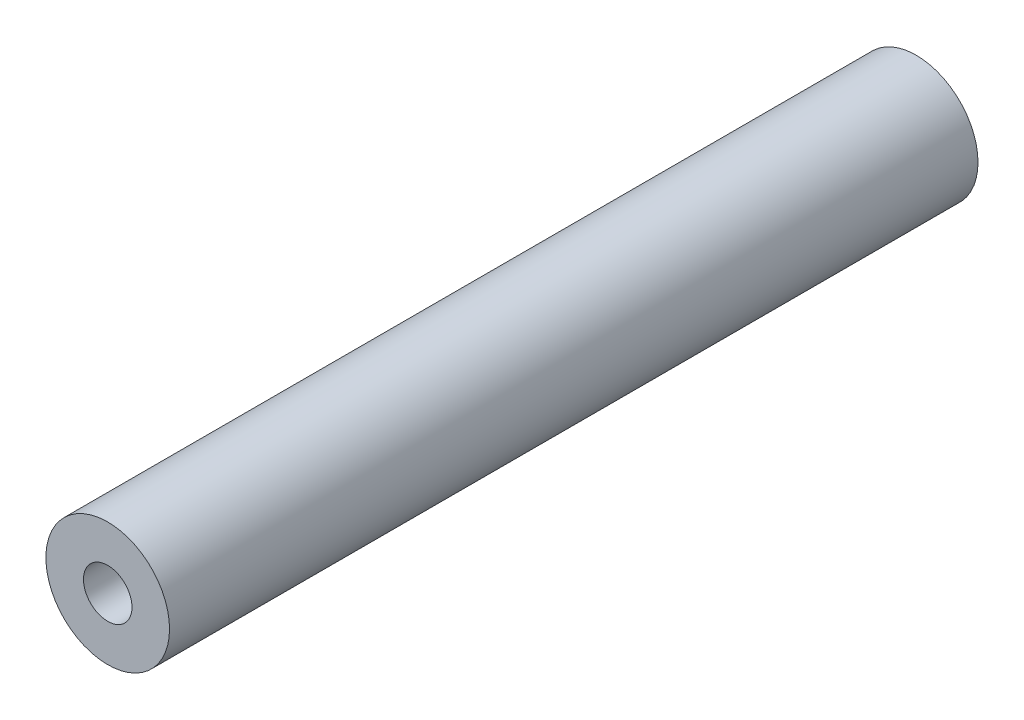
ISO-10303-21;
HEADER;
FILE_DESCRIPTION(('STEP AP214'),'2;1');
FILE_NAME('part.step','',(''),(''),'','','');
FILE_SCHEMA(('AUTOMOTIVE_DESIGN { 1 0 10303 214 1 1 1 1 }'));
ENDSEC;
DATA;
#1=APPLICATION_CONTEXT('core data for automotive mechanical design processes');
#2=APPLICATION_PROTOCOL_DEFINITION('international standard','automotive_design',2000,#1);
#3=PRODUCT_CONTEXT('',#1,'mechanical');
#4=PRODUCT('Part','Part','',(#3));
#5=PRODUCT_RELATED_PRODUCT_CATEGORY('part','',(#4));
#6=PRODUCT_DEFINITION_FORMATION('','',#4);
#7=PRODUCT_DEFINITION_CONTEXT('part definition',#1,'design');
#8=PRODUCT_DEFINITION('design','',#6,#7);
#9=PRODUCT_DEFINITION_SHAPE('','',#8);
#10=(LENGTH_UNIT() NAMED_UNIT(*) SI_UNIT(.MILLI.,.METRE.));
#11=(NAMED_UNIT(*) PLANE_ANGLE_UNIT() SI_UNIT($,.RADIAN.));
#12=(NAMED_UNIT(*) SI_UNIT($,.STERADIAN.) SOLID_ANGLE_UNIT());
#13=UNCERTAINTY_MEASURE_WITH_UNIT(LENGTH_MEASURE(1.E-05),#10,'distance_accuracy_value','');
#14=(GEOMETRIC_REPRESENTATION_CONTEXT(3) GLOBAL_UNCERTAINTY_ASSIGNED_CONTEXT((#13)) GLOBAL_UNIT_ASSIGNED_CONTEXT((#10,
#11,#12)) REPRESENTATION_CONTEXT('',''));
#15=CARTESIAN_POINT('',(0.,0.,0.));
#16=DIRECTION('',(0.,0.,1.));
#17=DIRECTION('',(1.,0.,0.));
#18=AXIS2_PLACEMENT_3D('',#15,#16,#17);
#19=CARTESIAN_POINT('',(0.,0.,85.));
#20=DIRECTION('',(0.,0.,1.));
#21=DIRECTION('',(1.,0.,0.));
#22=AXIS2_PLACEMENT_3D('',#19,#20,#21);
#23=PLANE('',#22);
#24=CARTESIAN_POINT('',(0.,0.,85.));
#25=DIRECTION('',(0.,0.,1.));
#26=DIRECTION('',(1.,0.,0.));
#27=AXIS2_PLACEMENT_3D('',#24,#25,#26);
#28=CIRCLE('',#27,6.5);
#29=CARTESIAN_POINT('',(6.5,0.,85.));
#30=VERTEX_POINT('',#29);
#31=EDGE_CURVE('E10',#30,#30,#28,.T.);
#32=ORIENTED_EDGE('',*,*,#31,.T.);
#33=EDGE_LOOP('',(#32));
#34=FACE_BOUND('',#33,.T.);
#35=CARTESIAN_POINT('',(0.,0.,85.));
#36=DIRECTION('',(0.,0.,1.));
#37=DIRECTION('',(1.,0.,0.));
#38=AXIS2_PLACEMENT_3D('',#35,#36,#37);
#39=CIRCLE('',#38,2.55);
#40=CARTESIAN_POINT('',(2.55,0.,85.));
#41=VERTEX_POINT('',#40);
#42=EDGE_CURVE('E42',#41,#41,#39,.T.);
#43=ORIENTED_EDGE('',*,*,#42,.F.);
#44=EDGE_LOOP('',(#43));
#45=FACE_BOUND('',#44,.T.);
#46=ADVANCED_FACE('F31',(#34,#45),#23,.T.);
#47=CARTESIAN_POINT('',(0.,0.,0.));
#48=DIRECTION('',(0.,0.,1.));
#49=DIRECTION('',(1.,0.,0.));
#50=AXIS2_PLACEMENT_3D('',#47,#48,#49);
#51=PLANE('',#50);
#52=CARTESIAN_POINT('',(0.,0.,0.));
#53=DIRECTION('',(0.,0.,1.));
#54=DIRECTION('',(1.,0.,0.));
#55=AXIS2_PLACEMENT_3D('',#52,#53,#54);
#56=CIRCLE('',#55,6.5);
#57=CARTESIAN_POINT('',(6.5,0.,0.));
#58=VERTEX_POINT('',#57);
#59=EDGE_CURVE('E35',#58,#58,#56,.T.);
#60=ORIENTED_EDGE('',*,*,#59,.F.);
#61=EDGE_LOOP('',(#60));
#62=FACE_BOUND('',#61,.T.);
#63=CARTESIAN_POINT('',(0.,0.,0.));
#64=DIRECTION('',(0.,0.,1.));
#65=DIRECTION('',(1.,0.,0.));
#66=AXIS2_PLACEMENT_3D('',#63,#64,#65);
#67=CIRCLE('',#66,2.55);
#68=CARTESIAN_POINT('',(2.55,0.,0.));
#69=VERTEX_POINT('',#68);
#70=EDGE_CURVE('E44',#69,#69,#67,.T.);
#71=ORIENTED_EDGE('',*,*,#70,.T.);
#72=EDGE_LOOP('',(#71));
#73=FACE_BOUND('',#72,.T.);
#74=ADVANCED_FACE('F54',(#62,#73),#51,.F.);
#75=CARTESIAN_POINT('',(0.,0.,85.));
#76=DIRECTION('',(0.,0.,-1.));
#77=DIRECTION('',(-1.,0.,0.));
#78=AXIS2_PLACEMENT_3D('',#75,#76,#77);
#79=CYLINDRICAL_SURFACE('',#78,6.5);
#80=ORIENTED_EDGE('',*,*,#31,.F.);
#81=EDGE_LOOP('',(#80));
#82=FACE_BOUND('',#81,.T.);
#83=ORIENTED_EDGE('',*,*,#59,.T.);
#84=EDGE_LOOP('',(#83));
#85=FACE_BOUND('',#84,.T.);
#86=ADVANCED_FACE('F33',(#82,#85),#79,.T.);
#87=CARTESIAN_POINT('',(0.,0.,85.));
#88=DIRECTION('',(0.,0.,-1.));
#89=DIRECTION('',(-1.,0.,0.));
#90=AXIS2_PLACEMENT_3D('',#87,#88,#89);
#91=CYLINDRICAL_SURFACE('',#90,2.55);
#92=ORIENTED_EDGE('',*,*,#42,.T.);
#93=EDGE_LOOP('',(#92));
#94=FACE_BOUND('',#93,.T.);
#95=ORIENTED_EDGE('',*,*,#70,.F.);
#96=EDGE_LOOP('',(#95));
#97=FACE_BOUND('',#96,.T.);
#98=ADVANCED_FACE('F50',(#94,#97),#91,.F.);
#99=CLOSED_SHELL('',(#46,#74,#86,#98));
#100=MANIFOLD_SOLID_BREP('B2',#99);
#101=ADVANCED_BREP_SHAPE_REPRESENTATION('',(#18,#100),#14);
#102=SHAPE_DEFINITION_REPRESENTATION(#9,#101);
ENDSEC;
END-ISO-10303-21;
